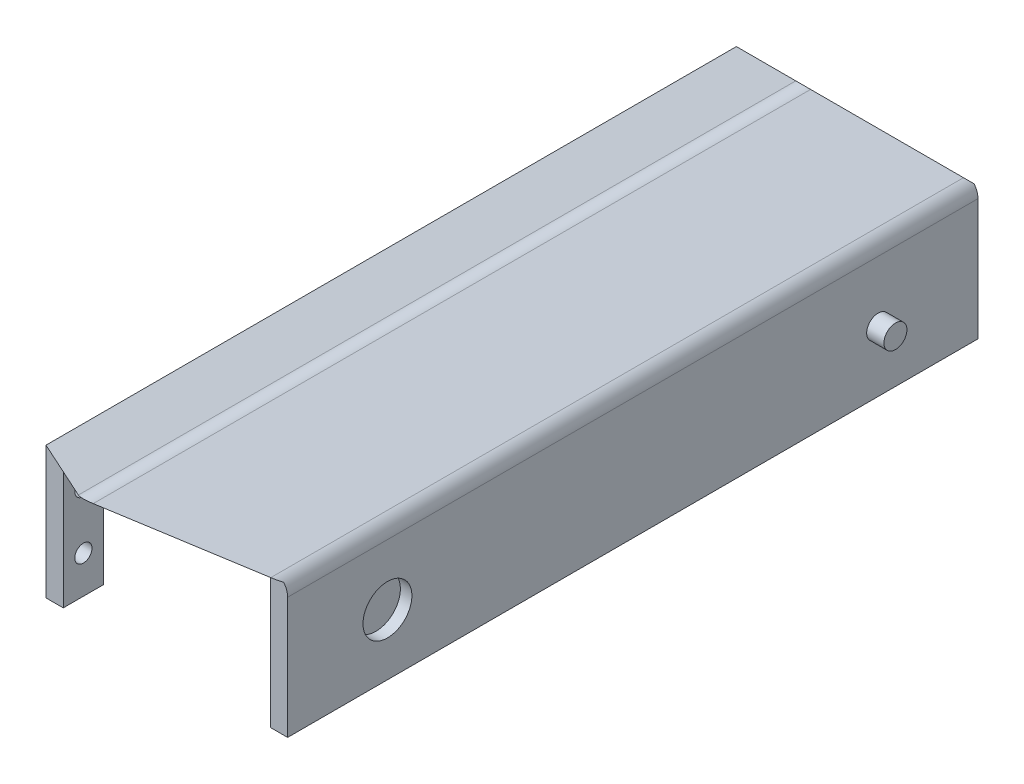
ISO-10303-21;
HEADER;
FILE_DESCRIPTION(('STEP AP214'),'2;1');
FILE_NAME('part.step','',(''),(''),'','','');
FILE_SCHEMA(('AUTOMOTIVE_DESIGN { 1 0 10303 214 1 1 1 1 }'));
ENDSEC;
DATA;
#1=APPLICATION_CONTEXT('core data for automotive mechanical design processes');
#2=APPLICATION_PROTOCOL_DEFINITION('international standard','automotive_design',2000,#1);
#3=PRODUCT_CONTEXT('',#1,'mechanical');
#4=PRODUCT('Part','Part','',(#3));
#5=PRODUCT_RELATED_PRODUCT_CATEGORY('part','',(#4));
#6=PRODUCT_DEFINITION_FORMATION('','',#4);
#7=PRODUCT_DEFINITION_CONTEXT('part definition',#1,'design');
#8=PRODUCT_DEFINITION('design','',#6,#7);
#9=PRODUCT_DEFINITION_SHAPE('','',#8);
#10=(LENGTH_UNIT() NAMED_UNIT(*) SI_UNIT(.MILLI.,.METRE.));
#11=(NAMED_UNIT(*) PLANE_ANGLE_UNIT() SI_UNIT($,.RADIAN.));
#12=(NAMED_UNIT(*) SI_UNIT($,.STERADIAN.) SOLID_ANGLE_UNIT());
#13=UNCERTAINTY_MEASURE_WITH_UNIT(LENGTH_MEASURE(1.E-05),#10,'distance_accuracy_value','');
#14=(GEOMETRIC_REPRESENTATION_CONTEXT(3) GLOBAL_UNCERTAINTY_ASSIGNED_CONTEXT((#13)) GLOBAL_UNIT_ASSIGNED_CONTEXT((#10,
#11,#12)) REPRESENTATION_CONTEXT('',''));
#15=CARTESIAN_POINT('',(0.,0.,0.));
#16=DIRECTION('',(0.,0.,1.));
#17=DIRECTION('',(1.,0.,0.));
#18=AXIS2_PLACEMENT_3D('',#15,#16,#17);
#19=CARTESIAN_POINT('',(-21.,0.,120.));
#20=DIRECTION('',(-1.,0.,0.));
#21=DIRECTION('',(0.,0.,1.));
#22=AXIS2_PLACEMENT_3D('',#19,#20,#21);
#23=PLANE('',#22);
#24=CARTESIAN_POINT('',(-21.,6.5,116.5));
#25=DIRECTION('',(-1.,0.,0.));
#26=DIRECTION('',(0.,0.,1.));
#27=AXIS2_PLACEMENT_3D('',#24,#25,#26);
#28=CIRCLE('',#27,1.5);
#29=CARTESIAN_POINT('',(-21.,6.5,118.));
#30=VERTEX_POINT('',#29);
#31=EDGE_CURVE('E210',#30,#30,#28,.F.);
#32=ORIENTED_EDGE('',*,*,#31,.T.);
#33=EDGE_LOOP('',(#32));
#34=FACE_BOUND('',#33,.T.);
#35=DIRECTION('',(0.,0.,-1.));
#36=VECTOR('',#35,1.);
#37=CARTESIAN_POINT('',(-21.,23.,120.));
#38=LINE('',#37,#36);
#39=CARTESIAN_POINT('',(-21.,23.,120.));
#40=VERTEX_POINT('',#39);
#41=CARTESIAN_POINT('',(-21.,23.,113.));
#42=VERTEX_POINT('',#41);
#43=EDGE_CURVE('E219',#40,#42,#38,.T.);
#44=ORIENTED_EDGE('',*,*,#43,.T.);
#45=DIRECTION('',(0.,-1.,0.));
#46=VECTOR('',#45,1.);
#47=CARTESIAN_POINT('',(-21.,0.,113.));
#48=LINE('',#47,#46);
#49=CARTESIAN_POINT('',(-21.,0.,113.));
#50=VERTEX_POINT('',#49);
#51=EDGE_CURVE('E201',#42,#50,#48,.T.);
#52=ORIENTED_EDGE('',*,*,#51,.T.);
#53=DIRECTION('',(0.,0.,-1.));
#54=VECTOR('',#53,1.);
#55=CARTESIAN_POINT('',(-21.,0.,120.));
#56=LINE('',#55,#54);
#57=CARTESIAN_POINT('',(-21.,0.,120.));
#58=VERTEX_POINT('',#57);
#59=EDGE_CURVE('E216',#58,#50,#56,.T.);
#60=ORIENTED_EDGE('',*,*,#59,.F.);
#61=DIRECTION('',(0.,1.,0.));
#62=VECTOR('',#61,1.);
#63=CARTESIAN_POINT('',(-21.,0.,120.));
#64=LINE('',#63,#62);
#65=EDGE_CURVE('E283',#58,#40,#64,.T.);
#66=ORIENTED_EDGE('',*,*,#65,.T.);
#67=EDGE_LOOP('',(#44,#52,#60,#66));
#68=FACE_BOUND('',#67,.T.);
#69=CARTESIAN_POINT('',(-21.,16.5,116.5));
#70=DIRECTION('',(-1.,0.,0.));
#71=DIRECTION('',(0.,0.,1.));
#72=AXIS2_PLACEMENT_3D('',#69,#70,#71);
#73=CIRCLE('',#72,1.5);
#74=CARTESIAN_POINT('',(-21.,16.5,118.));
#75=VERTEX_POINT('',#74);
#76=EDGE_CURVE('E579',#75,#75,#73,.F.);
#77=ORIENTED_EDGE('',*,*,#76,.T.);
#78=EDGE_LOOP('',(#77));
#79=FACE_BOUND('',#78,.T.);
#80=ADVANCED_FACE('F55',(#34,#68,#79),#23,.T.);
#81=CARTESIAN_POINT('',(-21.,6.5,70.));
#82=DIRECTION('',(-1.,0.,0.));
#83=DIRECTION('',(0.,0.,1.));
#84=AXIS2_PLACEMENT_3D('',#81,#82,#83);
#85=CIRCLE('',#84,1.50000000000001);
#86=CARTESIAN_POINT('',(-21.,6.5,71.5));
#87=VERTEX_POINT('',#86);
#88=EDGE_CURVE('E605',#87,#87,#85,.T.);
#89=ORIENTED_EDGE('',*,*,#88,.F.);
#90=EDGE_LOOP('',(#89));
#91=FACE_BOUND('',#90,.T.);
#92=DIRECTION('',(0.,-1.,0.));
#93=VECTOR('',#92,1.);
#94=CARTESIAN_POINT('',(-21.,0.,73.5));
#95=LINE('',#94,#93);
#96=CARTESIAN_POINT('',(-21.,23.,73.5));
#97=VERTEX_POINT('',#96);
#98=CARTESIAN_POINT('',(-21.,0.,73.5));
#99=VERTEX_POINT('',#98);
#100=EDGE_CURVE('E584',#97,#99,#95,.T.);
#101=ORIENTED_EDGE('',*,*,#100,.F.);
#102=CARTESIAN_POINT('',(-21.,23.,46.5));
#103=VERTEX_POINT('',#102);
#104=EDGE_CURVE('E235',#97,#103,#38,.T.);
#105=ORIENTED_EDGE('',*,*,#104,.T.);
#106=DIRECTION('',(0.,-1.,0.));
#107=VECTOR('',#106,1.);
#108=CARTESIAN_POINT('',(-21.,0.,46.5));
#109=LINE('',#108,#107);
#110=CARTESIAN_POINT('',(-21.,0.,46.5));
#111=VERTEX_POINT('',#110);
#112=EDGE_CURVE('E221',#103,#111,#109,.T.);
#113=ORIENTED_EDGE('',*,*,#112,.T.);
#114=EDGE_CURVE('E230',#99,#111,#56,.T.);
#115=ORIENTED_EDGE('',*,*,#114,.F.);
#116=EDGE_LOOP('',(#101,#105,#113,#115));
#117=FACE_BOUND('',#116,.T.);
#118=CARTESIAN_POINT('',(-21.,6.5,50.));
#119=DIRECTION('',(1.,0.,0.));
#120=DIRECTION('',(0.,0.,-1.));
#121=AXIS2_PLACEMENT_3D('',#118,#119,#120);
#122=CIRCLE('',#121,1.5);
#123=CARTESIAN_POINT('',(-21.,6.5,48.5));
#124=VERTEX_POINT('',#123);
#125=EDGE_CURVE('E549',#124,#124,#122,.T.);
#126=ORIENTED_EDGE('',*,*,#125,.T.);
#127=EDGE_LOOP('',(#126));
#128=FACE_BOUND('',#127,.T.);
#129=CARTESIAN_POINT('',(-21.,16.5,70.));
#130=DIRECTION('',(-1.,0.,0.));
#131=DIRECTION('',(0.,0.,1.));
#132=AXIS2_PLACEMENT_3D('',#129,#130,#131);
#133=CIRCLE('',#132,1.50000000000001);
#134=CARTESIAN_POINT('',(-21.,16.5,71.5));
#135=VERTEX_POINT('',#134);
#136=EDGE_CURVE('E550',#135,#135,#133,.T.);
#137=ORIENTED_EDGE('',*,*,#136,.F.);
#138=EDGE_LOOP('',(#137));
#139=FACE_BOUND('',#138,.T.);
#140=CARTESIAN_POINT('',(-21.,16.5,50.));
#141=DIRECTION('',(-1.,0.,0.));
#142=DIRECTION('',(0.,0.,1.));
#143=AXIS2_PLACEMENT_3D('',#140,#141,#142);
#144=CIRCLE('',#143,1.5);
#145=CARTESIAN_POINT('',(-21.,16.5,51.5));
#146=VERTEX_POINT('',#145);
#147=EDGE_CURVE('E570',#146,#146,#144,.F.);
#148=ORIENTED_EDGE('',*,*,#147,.T.);
#149=EDGE_LOOP('',(#148));
#150=FACE_BOUND('',#149,.T.);
#151=ADVANCED_FACE('F466',(#91,#117,#128,#139,#150),#23,.T.);
#152=CARTESIAN_POINT('',(0.,0.,120.));
#153=DIRECTION('',(0.,-1.,0.));
#154=DIRECTION('',(1.,0.,0.));
#155=AXIS2_PLACEMENT_3D('',#152,#153,#154);
#156=PLANE('',#155);
#157=ORIENTED_EDGE('',*,*,#59,.T.);
#158=DIRECTION('',(-1.,0.,0.));
#159=VECTOR('',#158,1.);
#160=CARTESIAN_POINT('',(-18.,0.,113.));
#161=LINE('',#160,#159);
#162=CARTESIAN_POINT('',(-18.,0.,113.));
#163=VERTEX_POINT('',#162);
#164=EDGE_CURVE('E198',#163,#50,#161,.T.);
#165=ORIENTED_EDGE('',*,*,#164,.F.);
#166=DIRECTION('',(0.,0.,-1.));
#167=VECTOR('',#166,1.);
#168=CARTESIAN_POINT('',(-18.,0.,120.));
#169=LINE('',#168,#167);
#170=CARTESIAN_POINT('',(-18.,0.,120.));
#171=VERTEX_POINT('',#170);
#172=EDGE_CURVE('E240',#171,#163,#169,.T.);
#173=ORIENTED_EDGE('',*,*,#172,.F.);
#174=DIRECTION('',(-1.,0.,0.));
#175=VECTOR('',#174,1.);
#176=CARTESIAN_POINT('',(0.,0.,120.));
#177=LINE('',#176,#175);
#178=EDGE_CURVE('E227',#171,#58,#177,.T.);
#179=ORIENTED_EDGE('',*,*,#178,.T.);
#180=EDGE_LOOP('',(#157,#165,#173,#179));
#181=FACE_BOUND('',#180,.T.);
#182=ADVANCED_FACE('F225',(#181),#156,.T.);
#183=DIRECTION('',(-1.,0.,0.));
#184=VECTOR('',#183,1.);
#185=CARTESIAN_POINT('',(-18.,0.,73.5));
#186=LINE('',#185,#184);
#187=CARTESIAN_POINT('',(-18.,0.,73.5));
#188=VERTEX_POINT('',#187);
#189=EDGE_CURVE('E209',#188,#99,#186,.T.);
#190=ORIENTED_EDGE('',*,*,#189,.T.);
#191=ORIENTED_EDGE('',*,*,#114,.T.);
#192=DIRECTION('',(-1.,0.,0.));
#193=VECTOR('',#192,1.);
#194=CARTESIAN_POINT('',(-18.,0.,46.5));
#195=LINE('',#194,#193);
#196=CARTESIAN_POINT('',(-18.,0.,46.5));
#197=VERTEX_POINT('',#196);
#198=EDGE_CURVE('E425',#197,#111,#195,.T.);
#199=ORIENTED_EDGE('',*,*,#198,.F.);
#200=EDGE_CURVE('E247',#188,#197,#169,.T.);
#201=ORIENTED_EDGE('',*,*,#200,.F.);
#202=EDGE_LOOP('',(#190,#191,#199,#201));
#203=FACE_BOUND('',#202,.T.);
#204=ADVANCED_FACE('F485',(#203),#156,.T.);
#205=CARTESIAN_POINT('',(-18.,0.,120.));
#206=DIRECTION('',(-1.,0.,0.));
#207=DIRECTION('',(0.,0.,1.));
#208=AXIS2_PLACEMENT_3D('',#205,#206,#207);
#209=PLANE('',#208);
#210=DIRECTION('',(0.,-1.,0.));
#211=VECTOR('',#210,1.);
#212=CARTESIAN_POINT('',(-18.,0.,113.));
#213=LINE('',#212,#211);
#214=CARTESIAN_POINT('',(-18.,23.,113.));
#215=VERTEX_POINT('',#214);
#216=EDGE_CURVE('E204',#215,#163,#213,.T.);
#217=ORIENTED_EDGE('',*,*,#216,.F.);
#218=DIRECTION('',(0.,0.,-1.));
#219=VECTOR('',#218,1.);
#220=CARTESIAN_POINT('',(-18.,23.,120.));
#221=LINE('',#220,#219);
#222=CARTESIAN_POINT('',(-18.,23.,120.));
#223=VERTEX_POINT('',#222);
#224=EDGE_CURVE('E255',#223,#215,#221,.T.);
#225=ORIENTED_EDGE('',*,*,#224,.F.);
#226=DIRECTION('',(0.,1.,0.));
#227=VECTOR('',#226,1.);
#228=CARTESIAN_POINT('',(-18.,0.,120.));
#229=LINE('',#228,#227);
#230=EDGE_CURVE('E272',#171,#223,#229,.T.);
#231=ORIENTED_EDGE('',*,*,#230,.F.);
#232=ORIENTED_EDGE('',*,*,#172,.T.);
#233=EDGE_LOOP('',(#217,#225,#231,#232));
#234=FACE_BOUND('',#233,.T.);
#235=CARTESIAN_POINT('',(-18.,6.5,116.5));
#236=DIRECTION('',(-1.,0.,0.));
#237=DIRECTION('',(0.,0.,1.));
#238=AXIS2_PLACEMENT_3D('',#235,#236,#237);
#239=CIRCLE('',#238,1.5);
#240=CARTESIAN_POINT('',(-18.,6.5,118.));
#241=VERTEX_POINT('',#240);
#242=EDGE_CURVE('E575',#241,#241,#239,.F.);
#243=ORIENTED_EDGE('',*,*,#242,.F.);
#244=EDGE_LOOP('',(#243));
#245=FACE_BOUND('',#244,.T.);
#246=CARTESIAN_POINT('',(-18.,16.5,116.5));
#247=DIRECTION('',(-1.,0.,0.));
#248=DIRECTION('',(0.,0.,1.));
#249=AXIS2_PLACEMENT_3D('',#246,#247,#248);
#250=CIRCLE('',#249,1.5);
#251=CARTESIAN_POINT('',(-18.,16.5,118.));
#252=VERTEX_POINT('',#251);
#253=EDGE_CURVE('E609',#252,#252,#250,.F.);
#254=ORIENTED_EDGE('',*,*,#253,.F.);
#255=EDGE_LOOP('',(#254));
#256=FACE_BOUND('',#255,.T.);
#257=ADVANCED_FACE('F719',(#234,#245,#256),#209,.F.);
#258=CARTESIAN_POINT('',(-18.,6.5,70.));
#259=DIRECTION('',(-1.,0.,0.));
#260=DIRECTION('',(0.,0.,1.));
#261=AXIS2_PLACEMENT_3D('',#258,#259,#260);
#262=CIRCLE('',#261,1.50000000000001);
#263=CARTESIAN_POINT('',(-18.,6.5,71.5));
#264=VERTEX_POINT('',#263);
#265=EDGE_CURVE('E574',#264,#264,#262,.T.);
#266=ORIENTED_EDGE('',*,*,#265,.T.);
#267=EDGE_LOOP('',(#266));
#268=FACE_BOUND('',#267,.T.);
#269=CARTESIAN_POINT('',(-18.,16.5,70.));
#270=DIRECTION('',(-1.,0.,0.));
#271=DIRECTION('',(0.,0.,1.));
#272=AXIS2_PLACEMENT_3D('',#269,#270,#271);
#273=CIRCLE('',#272,1.50000000000001);
#274=CARTESIAN_POINT('',(-18.,16.5,71.5));
#275=VERTEX_POINT('',#274);
#276=EDGE_CURVE('E616',#275,#275,#273,.T.);
#277=ORIENTED_EDGE('',*,*,#276,.T.);
#278=EDGE_LOOP('',(#277));
#279=FACE_BOUND('',#278,.T.);
#280=CARTESIAN_POINT('',(-18.,23.,73.5));
#281=VERTEX_POINT('',#280);
#282=CARTESIAN_POINT('',(-18.,23.,46.5));
#283=VERTEX_POINT('',#282);
#284=EDGE_CURVE('E262',#281,#283,#221,.T.);
#285=ORIENTED_EDGE('',*,*,#284,.F.);
#286=DIRECTION('',(0.,-1.,0.));
#287=VECTOR('',#286,1.);
#288=CARTESIAN_POINT('',(-18.,0.,73.5));
#289=LINE('',#288,#287);
#290=EDGE_CURVE('E79',#281,#188,#289,.T.);
#291=ORIENTED_EDGE('',*,*,#290,.T.);
#292=ORIENTED_EDGE('',*,*,#200,.T.);
#293=DIRECTION('',(0.,-1.,0.));
#294=VECTOR('',#293,1.);
#295=CARTESIAN_POINT('',(-18.,0.,46.5));
#296=LINE('',#295,#294);
#297=EDGE_CURVE('E498',#283,#197,#296,.T.);
#298=ORIENTED_EDGE('',*,*,#297,.F.);
#299=EDGE_LOOP('',(#285,#291,#292,#298));
#300=FACE_BOUND('',#299,.T.);
#301=CARTESIAN_POINT('',(-18.,6.5,50.));
#302=DIRECTION('',(1.,0.,0.));
#303=DIRECTION('',(0.,0.,-1.));
#304=AXIS2_PLACEMENT_3D('',#301,#302,#303);
#305=CIRCLE('',#304,1.5);
#306=CARTESIAN_POINT('',(-18.,6.5,48.5));
#307=VERTEX_POINT('',#306);
#308=EDGE_CURVE('E545',#307,#307,#305,.T.);
#309=ORIENTED_EDGE('',*,*,#308,.F.);
#310=EDGE_LOOP('',(#309));
#311=FACE_BOUND('',#310,.T.);
#312=CARTESIAN_POINT('',(-18.,16.5,50.));
#313=DIRECTION('',(-1.,0.,0.));
#314=DIRECTION('',(0.,0.,1.));
#315=AXIS2_PLACEMENT_3D('',#312,#313,#314);
#316=CIRCLE('',#315,1.5);
#317=CARTESIAN_POINT('',(-18.,16.5,51.5));
#318=VERTEX_POINT('',#317);
#319=EDGE_CURVE('E566',#318,#318,#316,.F.);
#320=ORIENTED_EDGE('',*,*,#319,.F.);
#321=EDGE_LOOP('',(#320));
#322=FACE_BOUND('',#321,.T.);
#323=ADVANCED_FACE('F538',(#268,#279,#300,#311,#322),#209,.F.);
#324=CARTESIAN_POINT('',(0.,0.,0.));
#325=DIRECTION('',(0.,0.,1.));
#326=DIRECTION('',(1.,0.,0.));
#327=AXIS2_PLACEMENT_3D('',#324,#325,#326);
#328=PLANE('',#327);
#329=DIRECTION('',(0.,1.,0.));
#330=VECTOR('',#329,1.);
#331=CARTESIAN_POINT('',(-21.,0.,0.));
#332=LINE('',#331,#330);
#333=CARTESIAN_POINT('',(-21.,0.,0.));
#334=VERTEX_POINT('',#333);
#335=CARTESIAN_POINT('',(-21.,23.,0.));
#336=VERTEX_POINT('',#335);
#337=EDGE_CURVE('E299',#334,#336,#332,.T.);
#338=ORIENTED_EDGE('',*,*,#337,.T.);
#339=DIRECTION('',(1.,0.,0.));
#340=VECTOR('',#339,1.);
#341=CARTESIAN_POINT('',(0.,23.,0.));
#342=LINE('',#341,#340);
#343=CARTESIAN_POINT('',(-18.,23.,0.));
#344=VERTEX_POINT('',#343);
#345=EDGE_CURVE('E359',#336,#344,#342,.T.);
#346=ORIENTED_EDGE('',*,*,#345,.T.);
#347=DIRECTION('',(0.,1.,0.));
#348=VECTOR('',#347,1.);
#349=CARTESIAN_POINT('',(-18.,0.,0.));
#350=LINE('',#349,#348);
#351=CARTESIAN_POINT('',(-18.,0.,0.));
#352=VERTEX_POINT('',#351);
#353=EDGE_CURVE('E306',#352,#344,#350,.T.);
#354=ORIENTED_EDGE('',*,*,#353,.F.);
#355=DIRECTION('',(-1.,0.,0.));
#356=VECTOR('',#355,1.);
#357=CARTESIAN_POINT('',(0.,0.,0.));
#358=LINE('',#357,#356);
#359=EDGE_CURVE('E303',#352,#334,#358,.T.);
#360=ORIENTED_EDGE('',*,*,#359,.T.);
#361=EDGE_LOOP('',(#338,#346,#354,#360));
#362=FACE_BOUND('',#361,.T.);
#363=ADVANCED_FACE('F507',(#362),#328,.F.);
#364=CARTESIAN_POINT('',(0.,0.,120.));
#365=DIRECTION('',(0.,0.,1.));
#366=DIRECTION('',(1.,0.,0.));
#367=AXIS2_PLACEMENT_3D('',#364,#365,#366);
#368=PLANE('',#367);
#369=DIRECTION('',(1.,0.,0.));
#370=VECTOR('',#369,1.);
#371=CARTESIAN_POINT('',(-18.,23.,120.));
#372=LINE('',#371,#370);
#373=EDGE_CURVE('E292',#40,#223,#372,.T.);
#374=ORIENTED_EDGE('',*,*,#373,.F.);
#375=ORIENTED_EDGE('',*,*,#65,.F.);
#376=ORIENTED_EDGE('',*,*,#178,.F.);
#377=ORIENTED_EDGE('',*,*,#230,.T.);
#378=EDGE_LOOP('',(#374,#375,#376,#377));
#379=FACE_BOUND('',#378,.T.);
#380=ADVANCED_FACE('F325',(#379),#368,.T.);
#381=CARTESIAN_POINT('',(-12.2357763871538,25.7400755325362,120.));
#382=DIRECTION('',(-0.429321334878652,0.903151809729689,0.));
#383=DIRECTION('',(-0.903151809729689,-0.429321334878652,0.));
#384=AXIS2_PLACEMENT_3D('',#381,#382,#383);
#385=PLANE('',#384);
#386=ORIENTED_EDGE('',*,*,#224,.T.);
#387=DIRECTION('',(0.,0.,-1.));
#388=VECTOR('',#387,1.);
#389=CARTESIAN_POINT('',(-18.,23.,0.));
#390=LINE('',#389,#388);
#391=EDGE_CURVE('E536',#215,#281,#390,.T.);
#392=ORIENTED_EDGE('',*,*,#391,.T.);
#393=ORIENTED_EDGE('',*,*,#284,.T.);
#394=DIRECTION('',(0.,0.,-1.));
#395=VECTOR('',#394,1.);
#396=CARTESIAN_POINT('',(-18.,23.,0.));
#397=LINE('',#396,#395);
#398=CARTESIAN_POINT('',(-18.,23.,7.00000000000001));
#399=VERTEX_POINT('',#398);
#400=EDGE_CURVE('E522',#283,#399,#397,.T.);
#401=ORIENTED_EDGE('',*,*,#400,.T.);
#402=EDGE_CURVE('E263',#399,#344,#221,.T.);
#403=ORIENTED_EDGE('',*,*,#402,.T.);
#404=DIRECTION('',(0.829901997593836,0.394501377937873,0.394501377937873));
#405=VECTOR('',#404,1.);
#406=CARTESIAN_POINT('',(26.154827576588,43.9893943767783,20.9893943767783));
#407=LINE('',#406,#405);
#408=CARTESIAN_POINT('',(0.,31.5564618755829,8.55646187558284));
#409=VERTEX_POINT('',#408);
#410=EDGE_CURVE('E422',#344,#409,#407,.T.);
#411=ORIENTED_EDGE('',*,*,#410,.T.);
#412=DIRECTION('',(0.,0.,-1.));
#413=VECTOR('',#412,1.);
#414=CARTESIAN_POINT('',(0.,31.5564618755828,120.));
#415=LINE('',#414,#413);
#416=CARTESIAN_POINT('',(0.,31.5564618755828,132.834692813374));
#417=VERTEX_POINT('',#416);
#418=EDGE_CURVE('E351',#417,#409,#415,.T.);
#419=ORIENTED_EDGE('',*,*,#418,.F.);
#420=DIRECTION('',(-0.759323099914227,-0.360951064203637,-0.541426596305456));
#421=VECTOR('',#420,1.);
#422=CARTESIAN_POINT('',(-13.9255168015939,24.936842230548,122.905263345822));
#423=LINE('',#422,#421);
#424=EDGE_CURVE('E402',#417,#223,#423,.T.);
#425=ORIENTED_EDGE('',*,*,#424,.T.);
#426=EDGE_LOOP('',(#386,#392,#393,#401,#403,#411,#419,#425));
#427=FACE_BOUND('',#426,.T.);
#428=ADVANCED_FACE('F439',(#427),#385,.F.);
#429=CARTESIAN_POINT('',(12.2357763871539,25.7400755325362,120.));
#430=DIRECTION('',(0.429321334878652,0.903151809729689,0.));
#431=DIRECTION('',(-0.903151809729689,0.429321334878652,0.));
#432=AXIS2_PLACEMENT_3D('',#429,#430,#431);
#433=PLANE('',#432);
#434=ORIENTED_EDGE('',*,*,#418,.T.);
#435=DIRECTION('',(0.829901997593836,-0.394501377937873,-0.394501377937873));
#436=VECTOR('',#435,1.);
#437=CARTESIAN_POINT('',(-26.154827576588,43.9893943767783,20.9893943767783));
#438=LINE('',#437,#436);
#439=CARTESIAN_POINT('',(18.,23.,0.));
#440=VERTEX_POINT('',#439);
#441=EDGE_CURVE('E416',#409,#440,#438,.T.);
#442=ORIENTED_EDGE('',*,*,#441,.T.);
#443=DIRECTION('',(0.,0.,-1.));
#444=VECTOR('',#443,1.);
#445=CARTESIAN_POINT('',(18.,23.,120.));
#446=LINE('',#445,#444);
#447=CARTESIAN_POINT('',(18.,23.,120.));
#448=VERTEX_POINT('',#447);
#449=EDGE_CURVE('E348',#448,#440,#446,.T.);
#450=ORIENTED_EDGE('',*,*,#449,.F.);
#451=DIRECTION('',(-0.759323099914226,0.360951064203637,0.541426596305456));
#452=VECTOR('',#451,1.);
#453=CARTESIAN_POINT('',(13.9255168015939,24.936842230548,122.905263345822));
#454=LINE('',#453,#452);
#455=EDGE_CURVE('E400',#448,#417,#454,.T.);
#456=ORIENTED_EDGE('',*,*,#455,.T.);
#457=EDGE_LOOP('',(#434,#442,#450,#456));
#458=FACE_BOUND('',#457,.T.);
#459=ADVANCED_FACE('F441',(#458),#433,.F.);
#460=CARTESIAN_POINT('',(18.,0.,120.));
#461=DIRECTION('',(-1.,0.,0.));
#462=DIRECTION('',(0.,-1.,0.));
#463=AXIS2_PLACEMENT_3D('',#460,#461,#462);
#464=PLANE('',#463);
#465=DIRECTION('',(0.,1.,0.));
#466=VECTOR('',#465,1.);
#467=CARTESIAN_POINT('',(18.,0.,0.));
#468=LINE('',#467,#466);
#469=CARTESIAN_POINT('',(18.,0.,0.));
#470=VERTEX_POINT('',#469);
#471=EDGE_CURVE('E287',#470,#440,#468,.T.);
#472=ORIENTED_EDGE('',*,*,#471,.F.);
#473=DIRECTION('',(0.,0.,-1.));
#474=VECTOR('',#473,1.);
#475=CARTESIAN_POINT('',(18.,0.,120.));
#476=LINE('',#475,#474);
#477=CARTESIAN_POINT('',(18.,0.,120.));
#478=VERTEX_POINT('',#477);
#479=EDGE_CURVE('E342',#478,#470,#476,.T.);
#480=ORIENTED_EDGE('',*,*,#479,.F.);
#481=DIRECTION('',(0.,1.,0.));
#482=VECTOR('',#481,1.);
#483=CARTESIAN_POINT('',(18.,0.,120.));
#484=LINE('',#483,#482);
#485=EDGE_CURVE('E308',#478,#448,#484,.T.);
#486=ORIENTED_EDGE('',*,*,#485,.T.);
#487=ORIENTED_EDGE('',*,*,#449,.T.);
#488=EDGE_LOOP('',(#472,#480,#486,#487));
#489=FACE_BOUND('',#488,.T.);
#490=ADVANCED_FACE('F443',(#489),#464,.T.);
#491=CARTESIAN_POINT('',(0.,0.,120.));
#492=DIRECTION('',(0.,-1.,0.));
#493=DIRECTION('',(1.,0.,0.));
#494=AXIS2_PLACEMENT_3D('',#491,#492,#493);
#495=PLANE('',#494);
#496=DIRECTION('',(-1.,0.,0.));
#497=VECTOR('',#496,1.);
#498=CARTESIAN_POINT('',(0.,0.,0.));
#499=LINE('',#498,#497);
#500=CARTESIAN_POINT('',(21.,0.,0.));
#501=VERTEX_POINT('',#500);
#502=EDGE_CURVE('E291',#501,#470,#499,.T.);
#503=ORIENTED_EDGE('',*,*,#502,.F.);
#504=DIRECTION('',(0.,0.,-1.));
#505=VECTOR('',#504,1.);
#506=CARTESIAN_POINT('',(21.,0.,120.));
#507=LINE('',#506,#505);
#508=CARTESIAN_POINT('',(21.,0.,120.));
#509=VERTEX_POINT('',#508);
#510=EDGE_CURVE('E338',#509,#501,#507,.T.);
#511=ORIENTED_EDGE('',*,*,#510,.F.);
#512=DIRECTION('',(-1.,0.,0.));
#513=VECTOR('',#512,1.);
#514=CARTESIAN_POINT('',(0.,0.,120.));
#515=LINE('',#514,#513);
#516=EDGE_CURVE('E311',#509,#478,#515,.T.);
#517=ORIENTED_EDGE('',*,*,#516,.T.);
#518=ORIENTED_EDGE('',*,*,#479,.T.);
#519=EDGE_LOOP('',(#503,#511,#517,#518));
#520=FACE_BOUND('',#519,.T.);
#521=ADVANCED_FACE('F450',(#520),#495,.T.);
#522=CARTESIAN_POINT('',(21.,0.,120.));
#523=DIRECTION('',(1.,0.,0.));
#524=DIRECTION('',(0.,0.,-1.));
#525=AXIS2_PLACEMENT_3D('',#522,#523,#524);
#526=PLANE('',#525);
#527=CARTESIAN_POINT('',(21.,10.5528995214839,17.350838596));
#528=DIRECTION('',(1.,0.,0.));
#529=DIRECTION('',(0.,0.,-1.));
#530=AXIS2_PLACEMENT_3D('',#527,#528,#529);
#531=CIRCLE('',#530,2.);
#532=CARTESIAN_POINT('',(21.,10.5528995214839,15.350838596));
#533=VERTEX_POINT('',#532);
#534=EDGE_CURVE('E632',#533,#533,#531,.T.);
#535=ORIENTED_EDGE('',*,*,#534,.F.);
#536=EDGE_LOOP('',(#535));
#537=FACE_BOUND('',#536,.T.);
#538=CARTESIAN_POINT('',(21.,10.5528995214839,102.649161404));
#539=DIRECTION('',(1.,0.,0.));
#540=DIRECTION('',(0.,0.,-1.));
#541=AXIS2_PLACEMENT_3D('',#538,#539,#540);
#542=CIRCLE('',#541,4.25000000000001);
#543=CARTESIAN_POINT('',(21.,10.5528995214839,98.399161404));
#544=VERTEX_POINT('',#543);
#545=EDGE_CURVE('E624',#544,#544,#542,.T.);
#546=ORIENTED_EDGE('',*,*,#545,.F.);
#547=EDGE_LOOP('',(#546));
#548=FACE_BOUND('',#547,.T.);
#549=DIRECTION('',(0.,-1.,0.));
#550=VECTOR('',#549,1.);
#551=CARTESIAN_POINT('',(21.,0.,0.));
#552=LINE('',#551,#550);
#553=CARTESIAN_POINT('',(21.,21.1057990429677,0.));
#554=VERTEX_POINT('',#553);
#555=EDGE_CURVE('E296',#554,#501,#552,.T.);
#556=ORIENTED_EDGE('',*,*,#555,.F.);
#557=DIRECTION('',(0.,0.,-1.));
#558=VECTOR('',#557,1.);
#559=CARTESIAN_POINT('',(21.,21.1057990429677,120.));
#560=LINE('',#559,#558);
#561=CARTESIAN_POINT('',(21.,21.1057990429677,120.));
#562=VERTEX_POINT('',#561);
#563=EDGE_CURVE('E383',#554,#562,#560,.F.);
#564=ORIENTED_EDGE('',*,*,#563,.T.);
#565=DIRECTION('',(0.,-1.,0.));
#566=VECTOR('',#565,1.);
#567=CARTESIAN_POINT('',(21.,0.,120.));
#568=LINE('',#567,#566);
#569=EDGE_CURVE('E318',#562,#509,#568,.T.);
#570=ORIENTED_EDGE('',*,*,#569,.T.);
#571=ORIENTED_EDGE('',*,*,#510,.T.);
#572=EDGE_LOOP('',(#556,#564,#570,#571));
#573=FACE_BOUND('',#572,.T.);
#574=ADVANCED_FACE('F452',(#537,#548,#573),#526,.T.);
#575=CARTESIAN_POINT('',(12.8096118299445,26.9001848428835,120.));
#576=DIRECTION('',(0.429933580392348,0.90286051882393,0.));
#577=DIRECTION('',(-0.90286051882393,0.429933580392348,0.));
#578=AXIS2_PLACEMENT_3D('',#575,#576,#577);
#579=PLANE('',#578);
#580=DIRECTION('',(-0.75876084220642,0.361314686764962,0.541972030147443));
#581=VECTOR('',#580,1.);
#582=CARTESIAN_POINT('',(15.2154046997389,25.7545691906005,124.131853785901));
#583=LINE('',#582,#581);
#584=CARTESIAN_POINT('',(19.289800741177,23.8143805994395,121.221570899159));
#585=VERTEX_POINT('',#584);
#586=CARTESIAN_POINT('',(1.28980074117705,32.3858091708681,134.078713756302));
#587=VERTEX_POINT('',#586);
#588=EDGE_CURVE('E411',#585,#587,#583,.T.);
#589=ORIENTED_EDGE('',*,*,#588,.F.);
#590=DIRECTION('',(0.,0.,-1.));
#591=VECTOR('',#590,1.);
#592=CARTESIAN_POINT('',(19.289800741177,23.8143805994395,120.));
#593=LINE('',#592,#591);
#594=CARTESIAN_POINT('',(19.289800741177,23.8143805994395,0.814380599439501));
#595=VERTEX_POINT('',#594);
#596=EDGE_CURVE('E373',#585,#595,#593,.T.);
#597=ORIENTED_EDGE('',*,*,#596,.T.);
#598=DIRECTION('',(0.829450130810032,-0.394976252766682,-0.394976252766682));
#599=VECTOR('',#598,1.);
#600=CARTESIAN_POINT('',(-25.2262090483619,45.01248049922,22.01248049922));
#601=LINE('',#600,#599);
#602=CARTESIAN_POINT('',(1.28980074117704,32.3858091708681,9.38580917086807));
#603=VERTEX_POINT('',#602);
#604=EDGE_CURVE('E409',#603,#595,#601,.T.);
#605=ORIENTED_EDGE('',*,*,#604,.F.);
#606=DIRECTION('',(0.,0.,-1.));
#607=VECTOR('',#606,1.);
#608=CARTESIAN_POINT('',(1.28980074117704,32.3858091708681,135.));
#609=LINE('',#608,#607);
#610=EDGE_CURVE('E366',#603,#587,#609,.F.);
#611=ORIENTED_EDGE('',*,*,#610,.T.);
#612=EDGE_LOOP('',(#589,#597,#605,#611));
#613=FACE_BOUND('',#612,.T.);
#614=ADVANCED_FACE('F408',(#613),#579,.T.);
#615=CARTESIAN_POINT('',(-12.8096118299445,26.9001848428835,120.));
#616=DIRECTION('',(0.429933580392348,-0.90286051882393,0.));
#617=DIRECTION('',(0.90286051882393,0.429933580392348,0.));
#618=AXIS2_PLACEMENT_3D('',#615,#616,#617);
#619=PLANE('',#618);
#620=DIRECTION('',(0.75876084220642,0.361314686764962,0.541972030147443));
#621=VECTOR('',#620,1.);
#622=CARTESIAN_POINT('',(-15.2154046997389,25.7545691906005,124.131853785901));
#623=LINE('',#622,#621);
#624=CARTESIAN_POINT('',(-1.28980074117705,32.3858091708681,134.078713756302));
#625=VERTEX_POINT('',#624);
#626=EDGE_CURVE('E333',#40,#625,#623,.T.);
#627=ORIENTED_EDGE('',*,*,#626,.T.);
#628=DIRECTION('',(0.,0.,-1.));
#629=VECTOR('',#628,1.);
#630=CARTESIAN_POINT('',(-1.28980074117704,32.3858091708681,9.99999999999999));
#631=LINE('',#630,#629);
#632=CARTESIAN_POINT('',(-1.28980074117704,32.3858091708681,9.38580917086807));
#633=VERTEX_POINT('',#632);
#634=EDGE_CURVE('E360',#625,#633,#631,.T.);
#635=ORIENTED_EDGE('',*,*,#634,.T.);
#636=DIRECTION('',(-0.829450130810032,-0.394976252766682,-0.394976252766682));
#637=VECTOR('',#636,1.);
#638=CARTESIAN_POINT('',(25.2262090483619,45.01248049922,22.01248049922));
#639=LINE('',#638,#637);
#640=EDGE_CURVE('E417',#633,#336,#639,.T.);
#641=ORIENTED_EDGE('',*,*,#640,.T.);
#642=CARTESIAN_POINT('',(-21.,23.,7.));
#643=VERTEX_POINT('',#642);
#644=EDGE_CURVE('E229',#643,#336,#38,.T.);
#645=ORIENTED_EDGE('',*,*,#644,.F.);
#646=DIRECTION('',(0.,0.,-1.));
#647=VECTOR('',#646,1.);
#648=CARTESIAN_POINT('',(-21.,23.,0.));
#649=LINE('',#648,#647);
#650=EDGE_CURVE('E499',#103,#643,#649,.T.);
#651=ORIENTED_EDGE('',*,*,#650,.F.);
#652=ORIENTED_EDGE('',*,*,#104,.F.);
#653=DIRECTION('',(0.,0.,-1.));
#654=VECTOR('',#653,1.);
#655=CARTESIAN_POINT('',(-21.,23.,0.));
#656=LINE('',#655,#654);
#657=EDGE_CURVE('E222',#42,#97,#656,.T.);
#658=ORIENTED_EDGE('',*,*,#657,.F.);
#659=ORIENTED_EDGE('',*,*,#43,.F.);
#660=EDGE_LOOP('',(#627,#635,#641,#645,#651,#652,#658,#659));
#661=FACE_BOUND('',#660,.T.);
#662=ADVANCED_FACE('F331',(#661),#619,.F.);
#663=CARTESIAN_POINT('',(-21.,16.5,3.5));
#664=DIRECTION('',(-1.,0.,0.));
#665=DIRECTION('',(0.,0.,1.));
#666=AXIS2_PLACEMENT_3D('',#663,#664,#665);
#667=CIRCLE('',#666,1.5);
#668=CARTESIAN_POINT('',(-21.,16.5,5.));
#669=VERTEX_POINT('',#668);
#670=EDGE_CURVE('E489',#669,#669,#667,.T.);
#671=ORIENTED_EDGE('',*,*,#670,.F.);
#672=EDGE_LOOP('',(#671));
#673=FACE_BOUND('',#672,.T.);
#674=CARTESIAN_POINT('',(-21.,6.5,3.5));
#675=DIRECTION('',(-1.,0.,0.));
#676=DIRECTION('',(0.,0.,1.));
#677=AXIS2_PLACEMENT_3D('',#674,#675,#676);
#678=CIRCLE('',#677,1.5);
#679=CARTESIAN_POINT('',(-21.,6.5,5.));
#680=VERTEX_POINT('',#679);
#681=EDGE_CURVE('E493',#680,#680,#678,.T.);
#682=ORIENTED_EDGE('',*,*,#681,.F.);
#683=EDGE_LOOP('',(#682));
#684=FACE_BOUND('',#683,.T.);
#685=DIRECTION('',(0.,-1.,0.));
#686=VECTOR('',#685,1.);
#687=CARTESIAN_POINT('',(-21.,0.,7.));
#688=LINE('',#687,#686);
#689=CARTESIAN_POINT('',(-21.,0.,7.));
#690=VERTEX_POINT('',#689);
#691=EDGE_CURVE('E495',#643,#690,#688,.T.);
#692=ORIENTED_EDGE('',*,*,#691,.F.);
#693=ORIENTED_EDGE('',*,*,#644,.T.);
#694=ORIENTED_EDGE('',*,*,#337,.F.);
#695=EDGE_CURVE('E232',#690,#334,#56,.T.);
#696=ORIENTED_EDGE('',*,*,#695,.F.);
#697=EDGE_LOOP('',(#692,#693,#694,#696));
#698=FACE_BOUND('',#697,.T.);
#699=ADVANCED_FACE('F469',(#673,#684,#698),#23,.T.);
#700=DIRECTION('',(-1.,0.,0.));
#701=VECTOR('',#700,1.);
#702=CARTESIAN_POINT('',(-18.,0.,7.));
#703=LINE('',#702,#701);
#704=CARTESIAN_POINT('',(-18.,0.,7.));
#705=VERTEX_POINT('',#704);
#706=EDGE_CURVE('E508',#705,#690,#703,.T.);
#707=ORIENTED_EDGE('',*,*,#706,.T.);
#708=ORIENTED_EDGE('',*,*,#695,.T.);
#709=ORIENTED_EDGE('',*,*,#359,.F.);
#710=EDGE_CURVE('E248',#705,#352,#169,.T.);
#711=ORIENTED_EDGE('',*,*,#710,.F.);
#712=EDGE_LOOP('',(#707,#708,#709,#711));
#713=FACE_BOUND('',#712,.T.);
#714=ADVANCED_FACE('F478',(#713),#156,.T.);
#715=CARTESIAN_POINT('',(-18.,16.5,3.5));
#716=DIRECTION('',(-1.,0.,0.));
#717=DIRECTION('',(0.,0.,1.));
#718=AXIS2_PLACEMENT_3D('',#715,#716,#717);
#719=CIRCLE('',#718,1.5);
#720=CARTESIAN_POINT('',(-18.,16.5,5.));
#721=VERTEX_POINT('',#720);
#722=EDGE_CURVE('E560',#721,#721,#719,.T.);
#723=ORIENTED_EDGE('',*,*,#722,.T.);
#724=EDGE_LOOP('',(#723));
#725=FACE_BOUND('',#724,.T.);
#726=CARTESIAN_POINT('',(-18.,6.5,3.5));
#727=DIRECTION('',(-1.,0.,0.));
#728=DIRECTION('',(0.,0.,1.));
#729=AXIS2_PLACEMENT_3D('',#726,#727,#728);
#730=CIRCLE('',#729,1.5);
#731=CARTESIAN_POINT('',(-18.,6.5,5.));
#732=VERTEX_POINT('',#731);
#733=EDGE_CURVE('E554',#732,#732,#730,.T.);
#734=ORIENTED_EDGE('',*,*,#733,.T.);
#735=EDGE_LOOP('',(#734));
#736=FACE_BOUND('',#735,.T.);
#737=ORIENTED_EDGE('',*,*,#402,.F.);
#738=DIRECTION('',(0.,-1.,0.));
#739=VECTOR('',#738,1.);
#740=CARTESIAN_POINT('',(-18.,0.,7.));
#741=LINE('',#740,#739);
#742=EDGE_CURVE('E71',#399,#705,#741,.T.);
#743=ORIENTED_EDGE('',*,*,#742,.T.);
#744=ORIENTED_EDGE('',*,*,#710,.T.);
#745=ORIENTED_EDGE('',*,*,#353,.T.);
#746=EDGE_LOOP('',(#737,#743,#744,#745));
#747=FACE_BOUND('',#746,.T.);
#748=ADVANCED_FACE('F484',(#725,#736,#747),#209,.F.);
#749=ORIENTED_EDGE('',*,*,#569,.F.);
#750=CARTESIAN_POINT('',(18.,21.1057990429677,120.));
#751=DIRECTION('',(0.,0.,1.));
#752=DIRECTION('',(1.,0.,0.));
#753=AXIS2_PLACEMENT_3D('',#750,#751,#752);
#754=CIRCLE('',#753,3.);
#755=CARTESIAN_POINT('',(20.326371151467,23.,120.));
#756=VERTEX_POINT('',#755);
#757=EDGE_CURVE('E64',#562,#756,#754,.T.);
#758=ORIENTED_EDGE('',*,*,#757,.T.);
#759=DIRECTION('',(1.,0.,0.));
#760=VECTOR('',#759,1.);
#761=CARTESIAN_POINT('',(21.,23.,120.));
#762=LINE('',#761,#760);
#763=EDGE_CURVE('E328',#448,#756,#762,.T.);
#764=ORIENTED_EDGE('',*,*,#763,.F.);
#765=ORIENTED_EDGE('',*,*,#485,.F.);
#766=ORIENTED_EDGE('',*,*,#516,.F.);
#767=EDGE_LOOP('',(#749,#758,#764,#765,#766));
#768=FACE_BOUND('',#767,.T.);
#769=ADVANCED_FACE('F391',(#768),#368,.T.);
#770=CARTESIAN_POINT('',(20.326371151467,23.,0.));
#771=VERTEX_POINT('',#770);
#772=EDGE_CURVE('E355',#440,#771,#342,.T.);
#773=ORIENTED_EDGE('',*,*,#772,.T.);
#774=CARTESIAN_POINT('',(18.,21.1057990429677,0.));
#775=DIRECTION('',(0.,0.,1.));
#776=DIRECTION('',(1.,0.,0.));
#777=AXIS2_PLACEMENT_3D('',#774,#775,#776);
#778=CIRCLE('',#777,3.);
#779=EDGE_CURVE('E380',#771,#554,#778,.F.);
#780=ORIENTED_EDGE('',*,*,#779,.T.);
#781=ORIENTED_EDGE('',*,*,#555,.T.);
#782=ORIENTED_EDGE('',*,*,#502,.T.);
#783=ORIENTED_EDGE('',*,*,#471,.T.);
#784=EDGE_LOOP('',(#773,#780,#781,#782,#783));
#785=FACE_BOUND('',#784,.T.);
#786=ADVANCED_FACE('F445',(#785),#328,.F.);
#787=CARTESIAN_POINT('',(22.,23.,120.));
#788=DIRECTION('',(0.,0.832050294337844,-0.554700196225229));
#789=DIRECTION('',(0.,0.554700196225229,0.832050294337844));
#790=AXIS2_PLACEMENT_3D('',#787,#788,#789);
#791=PLANE('',#790);
#792=ORIENTED_EDGE('',*,*,#763,.T.);
#793=CARTESIAN_POINT('',(18.,21.1057990429677,117.158698564452));
#794=DIRECTION('',(0.,0.832050294337844,-0.554700196225229));
#795=DIRECTION('',(0.,-0.554700196225229,-0.832050294337844));
#796=AXIS2_PLACEMENT_3D('',#793,#794,#795);
#797=ELLIPSE('',#796,5.40832691319599,3.);
#798=EDGE_CURVE('E11',#756,#585,#797,.F.);
#799=ORIENTED_EDGE('',*,*,#798,.T.);
#800=ORIENTED_EDGE('',*,*,#588,.T.);
#801=CARTESIAN_POINT('',(0.,29.6772276143963,130.015841421594));
#802=DIRECTION('',(0.,0.832050294337844,-0.554700196225229));
#803=DIRECTION('',(0.,0.554700196225229,0.832050294337844));
#804=AXIS2_PLACEMENT_3D('',#801,#802,#803);
#805=ELLIPSE('',#804,5.40832691319599,3.);
#806=EDGE_CURVE('E370',#587,#625,#805,.F.);
#807=ORIENTED_EDGE('',*,*,#806,.T.);
#808=ORIENTED_EDGE('',*,*,#626,.F.);
#809=ORIENTED_EDGE('',*,*,#373,.T.);
#810=ORIENTED_EDGE('',*,*,#424,.F.);
#811=ORIENTED_EDGE('',*,*,#455,.F.);
#812=EDGE_LOOP('',(#792,#799,#800,#807,#808,#809,#810,#811));
#813=FACE_BOUND('',#812,.T.);
#814=ADVANCED_FACE('F397',(#813),#791,.F.);
#815=CARTESIAN_POINT('',(-22.,33.,10.));
#816=DIRECTION('',(0.,-0.707106781186548,0.707106781186547));
#817=DIRECTION('',(0.,-0.707106781186547,-0.707106781186548));
#818=AXIS2_PLACEMENT_3D('',#815,#816,#817);
#819=PLANE('',#818);
#820=ORIENTED_EDGE('',*,*,#604,.T.);
#821=CARTESIAN_POINT('',(18.,21.1057990429677,-1.89420095703229));
#822=DIRECTION('',(0.,-0.707106781186548,0.707106781186547));
#823=DIRECTION('',(0.,-0.707106781186547,-0.707106781186548));
#824=AXIS2_PLACEMENT_3D('',#821,#822,#823);
#825=ELLIPSE('',#824,4.24264068711929,3.);
#826=EDGE_CURVE('E377',#595,#771,#825,.F.);
#827=ORIENTED_EDGE('',*,*,#826,.T.);
#828=ORIENTED_EDGE('',*,*,#772,.F.);
#829=ORIENTED_EDGE('',*,*,#441,.F.);
#830=ORIENTED_EDGE('',*,*,#410,.F.);
#831=ORIENTED_EDGE('',*,*,#345,.F.);
#832=ORIENTED_EDGE('',*,*,#640,.F.);
#833=CARTESIAN_POINT('',(0.,29.6772276143963,6.67722761439629));
#834=DIRECTION('',(0.,-0.707106781186548,0.707106781186547));
#835=DIRECTION('',(0.,0.707106781186547,0.707106781186548));
#836=AXIS2_PLACEMENT_3D('',#833,#834,#835);
#837=ELLIPSE('',#836,4.24264068711929,3.);
#838=EDGE_CURVE('E363',#633,#603,#837,.F.);
#839=ORIENTED_EDGE('',*,*,#838,.T.);
#840=EDGE_LOOP('',(#820,#827,#828,#829,#830,#831,#832,#839));
#841=FACE_BOUND('',#840,.T.);
#842=ADVANCED_FACE('F413',(#841),#819,.F.);
#843=CARTESIAN_POINT('',(0.,29.6772276143963,120.));
#844=DIRECTION('',(0.,0.,1.));
#845=DIRECTION('',(1.,0.,0.));
#846=AXIS2_PLACEMENT_3D('',#843,#844,#845);
#847=CYLINDRICAL_SURFACE('',#846,3.);
#848=ORIENTED_EDGE('',*,*,#806,.F.);
#849=ORIENTED_EDGE('',*,*,#610,.F.);
#850=ORIENTED_EDGE('',*,*,#838,.F.);
#851=ORIENTED_EDGE('',*,*,#634,.F.);
#852=EDGE_LOOP('',(#848,#849,#850,#851));
#853=FACE_BOUND('',#852,.T.);
#854=ADVANCED_FACE('F711',(#853),#847,.T.);
#855=CARTESIAN_POINT('',(18.,21.1057990429677,120.));
#856=DIRECTION('',(0.,0.,-1.));
#857=DIRECTION('',(-1.,0.,0.));
#858=AXIS2_PLACEMENT_3D('',#855,#856,#857);
#859=CYLINDRICAL_SURFACE('',#858,3.);
#860=ORIENTED_EDGE('',*,*,#757,.F.);
#861=ORIENTED_EDGE('',*,*,#563,.F.);
#862=ORIENTED_EDGE('',*,*,#779,.F.);
#863=ORIENTED_EDGE('',*,*,#826,.F.);
#864=ORIENTED_EDGE('',*,*,#596,.F.);
#865=ORIENTED_EDGE('',*,*,#798,.F.);
#866=EDGE_LOOP('',(#860,#861,#862,#863,#864,#865));
#867=FACE_BOUND('',#866,.T.);
#868=ADVANCED_FACE('F57',(#867),#859,.T.);
#869=CARTESIAN_POINT('',(-18.,0.,46.5));
#870=DIRECTION('',(0.,0.,-1.));
#871=DIRECTION('',(-1.,0.,0.));
#872=AXIS2_PLACEMENT_3D('',#869,#870,#871);
#873=PLANE('',#872);
#874=ORIENTED_EDGE('',*,*,#112,.F.);
#875=DIRECTION('',(-1.,0.,0.));
#876=VECTOR('',#875,1.);
#877=CARTESIAN_POINT('',(-18.,23.,46.5));
#878=LINE('',#877,#876);
#879=EDGE_CURVE('E515',#283,#103,#878,.T.);
#880=ORIENTED_EDGE('',*,*,#879,.F.);
#881=ORIENTED_EDGE('',*,*,#297,.T.);
#882=ORIENTED_EDGE('',*,*,#198,.T.);
#883=EDGE_LOOP('',(#874,#880,#881,#882));
#884=FACE_BOUND('',#883,.T.);
#885=ADVANCED_FACE('F704',(#884),#873,.T.);
#886=CARTESIAN_POINT('',(-18.,0.,7.));
#887=DIRECTION('',(0.,0.,-1.));
#888=DIRECTION('',(0.,1.,0.));
#889=AXIS2_PLACEMENT_3D('',#886,#887,#888);
#890=PLANE('',#889);
#891=ORIENTED_EDGE('',*,*,#691,.T.);
#892=ORIENTED_EDGE('',*,*,#706,.F.);
#893=ORIENTED_EDGE('',*,*,#742,.F.);
#894=DIRECTION('',(-1.,0.,0.));
#895=VECTOR('',#894,1.);
#896=CARTESIAN_POINT('',(-18.,23.,7.));
#897=LINE('',#896,#895);
#898=EDGE_CURVE('E510',#399,#643,#897,.T.);
#899=ORIENTED_EDGE('',*,*,#898,.T.);
#900=EDGE_LOOP('',(#891,#892,#893,#899));
#901=FACE_BOUND('',#900,.T.);
#902=ADVANCED_FACE('F701',(#901),#890,.F.);
#903=CARTESIAN_POINT('',(-18.,23.,0.));
#904=DIRECTION('',(0.,1.,0.));
#905=DIRECTION('',(0.,0.,1.));
#906=AXIS2_PLACEMENT_3D('',#903,#904,#905);
#907=PLANE('',#906);
#908=ORIENTED_EDGE('',*,*,#650,.T.);
#909=ORIENTED_EDGE('',*,*,#898,.F.);
#910=ORIENTED_EDGE('',*,*,#400,.F.);
#911=ORIENTED_EDGE('',*,*,#879,.T.);
#912=EDGE_LOOP('',(#908,#909,#910,#911));
#913=FACE_BOUND('',#912,.T.);
#914=ADVANCED_FACE('F532',(#913),#907,.F.);
#915=CARTESIAN_POINT('',(-18.,16.5,70.));
#916=DIRECTION('',(-1.,0.,0.));
#917=DIRECTION('',(0.,0.,1.));
#918=AXIS2_PLACEMENT_3D('',#915,#916,#917);
#919=CYLINDRICAL_SURFACE('',#918,1.50000000000001);
#920=ORIENTED_EDGE('',*,*,#276,.F.);
#921=EDGE_LOOP('',(#920));
#922=FACE_BOUND('',#921,.T.);
#923=ORIENTED_EDGE('',*,*,#136,.T.);
#924=EDGE_LOOP('',(#923));
#925=FACE_BOUND('',#924,.T.);
#926=ADVANCED_FACE('F661',(#922,#925),#919,.F.);
#927=CARTESIAN_POINT('',(-18.,6.5,50.));
#928=DIRECTION('',(-1.,0.,0.));
#929=DIRECTION('',(0.,0.,1.));
#930=AXIS2_PLACEMENT_3D('',#927,#928,#929);
#931=CYLINDRICAL_SURFACE('',#930,1.5);
#932=ORIENTED_EDGE('',*,*,#308,.T.);
#933=EDGE_LOOP('',(#932));
#934=FACE_BOUND('',#933,.T.);
#935=ORIENTED_EDGE('',*,*,#125,.F.);
#936=EDGE_LOOP('',(#935));
#937=FACE_BOUND('',#936,.T.);
#938=ADVANCED_FACE('F664',(#934,#937),#931,.F.);
#939=CARTESIAN_POINT('',(-18.,6.5,3.5));
#940=DIRECTION('',(-1.,0.,0.));
#941=DIRECTION('',(0.,0.,1.));
#942=AXIS2_PLACEMENT_3D('',#939,#940,#941);
#943=CYLINDRICAL_SURFACE('',#942,1.5);
#944=ORIENTED_EDGE('',*,*,#733,.F.);
#945=EDGE_LOOP('',(#944));
#946=FACE_BOUND('',#945,.T.);
#947=ORIENTED_EDGE('',*,*,#681,.T.);
#948=EDGE_LOOP('',(#947));
#949=FACE_BOUND('',#948,.T.);
#950=ADVANCED_FACE('F693',(#946,#949),#943,.F.);
#951=CARTESIAN_POINT('',(-18.,16.5,3.5));
#952=DIRECTION('',(-1.,0.,0.));
#953=DIRECTION('',(0.,0.,1.));
#954=AXIS2_PLACEMENT_3D('',#951,#952,#953);
#955=CYLINDRICAL_SURFACE('',#954,1.5);
#956=ORIENTED_EDGE('',*,*,#722,.F.);
#957=EDGE_LOOP('',(#956));
#958=FACE_BOUND('',#957,.T.);
#959=ORIENTED_EDGE('',*,*,#670,.T.);
#960=EDGE_LOOP('',(#959));
#961=FACE_BOUND('',#960,.T.);
#962=ADVANCED_FACE('F689',(#958,#961),#955,.F.);
#963=CARTESIAN_POINT('',(-18.,16.5,50.));
#964=DIRECTION('',(-1.,0.,0.));
#965=DIRECTION('',(0.,0.,1.));
#966=AXIS2_PLACEMENT_3D('',#963,#964,#965);
#967=CYLINDRICAL_SURFACE('',#966,1.5);
#968=ORIENTED_EDGE('',*,*,#319,.T.);
#969=EDGE_LOOP('',(#968));
#970=FACE_BOUND('',#969,.T.);
#971=ORIENTED_EDGE('',*,*,#147,.F.);
#972=EDGE_LOOP('',(#971));
#973=FACE_BOUND('',#972,.T.);
#974=ADVANCED_FACE('F677',(#970,#973),#967,.F.);
#975=CARTESIAN_POINT('',(-18.,0.,113.));
#976=DIRECTION('',(0.,0.,-1.));
#977=DIRECTION('',(0.,1.,0.));
#978=AXIS2_PLACEMENT_3D('',#975,#976,#977);
#979=PLANE('',#978);
#980=ORIENTED_EDGE('',*,*,#51,.F.);
#981=DIRECTION('',(-1.,0.,0.));
#982=VECTOR('',#981,1.);
#983=CARTESIAN_POINT('',(-18.,23.,113.));
#984=LINE('',#983,#982);
#985=EDGE_CURVE('E588',#215,#42,#984,.T.);
#986=ORIENTED_EDGE('',*,*,#985,.F.);
#987=ORIENTED_EDGE('',*,*,#216,.T.);
#988=ORIENTED_EDGE('',*,*,#164,.T.);
#989=EDGE_LOOP('',(#980,#986,#987,#988));
#990=FACE_BOUND('',#989,.T.);
#991=ADVANCED_FACE('F200',(#990),#979,.T.);
#992=CARTESIAN_POINT('',(-18.,0.,73.5));
#993=DIRECTION('',(0.,0.,-1.));
#994=DIRECTION('',(-1.,0.,0.));
#995=AXIS2_PLACEMENT_3D('',#992,#993,#994);
#996=PLANE('',#995);
#997=ORIENTED_EDGE('',*,*,#100,.T.);
#998=ORIENTED_EDGE('',*,*,#189,.F.);
#999=ORIENTED_EDGE('',*,*,#290,.F.);
#1000=DIRECTION('',(-1.,0.,0.));
#1001=VECTOR('',#1000,1.);
#1002=CARTESIAN_POINT('',(-18.,23.,73.5));
#1003=LINE('',#1002,#1001);
#1004=EDGE_CURVE('E597',#281,#97,#1003,.T.);
#1005=ORIENTED_EDGE('',*,*,#1004,.T.);
#1006=EDGE_LOOP('',(#997,#998,#999,#1005));
#1007=FACE_BOUND('',#1006,.T.);
#1008=ADVANCED_FACE('F676',(#1007),#996,.F.);
#1009=CARTESIAN_POINT('',(-18.,23.,0.));
#1010=DIRECTION('',(0.,1.,0.));
#1011=DIRECTION('',(0.,0.,1.));
#1012=AXIS2_PLACEMENT_3D('',#1009,#1010,#1011);
#1013=PLANE('',#1012);
#1014=ORIENTED_EDGE('',*,*,#657,.T.);
#1015=ORIENTED_EDGE('',*,*,#1004,.F.);
#1016=ORIENTED_EDGE('',*,*,#391,.F.);
#1017=ORIENTED_EDGE('',*,*,#985,.T.);
#1018=EDGE_LOOP('',(#1014,#1015,#1016,#1017));
#1019=FACE_BOUND('',#1018,.T.);
#1020=ADVANCED_FACE('F678',(#1019),#1013,.F.);
#1021=CARTESIAN_POINT('',(-18.,6.5,116.5));
#1022=DIRECTION('',(-1.,0.,0.));
#1023=DIRECTION('',(0.,0.,1.));
#1024=AXIS2_PLACEMENT_3D('',#1021,#1022,#1023);
#1025=CYLINDRICAL_SURFACE('',#1024,1.5);
#1026=ORIENTED_EDGE('',*,*,#242,.T.);
#1027=EDGE_LOOP('',(#1026));
#1028=FACE_BOUND('',#1027,.T.);
#1029=ORIENTED_EDGE('',*,*,#31,.F.);
#1030=EDGE_LOOP('',(#1029));
#1031=FACE_BOUND('',#1030,.T.);
#1032=ADVANCED_FACE('F669',(#1028,#1031),#1025,.F.);
#1033=CARTESIAN_POINT('',(-18.,16.5,116.5));
#1034=DIRECTION('',(-1.,0.,0.));
#1035=DIRECTION('',(0.,0.,1.));
#1036=AXIS2_PLACEMENT_3D('',#1033,#1034,#1035);
#1037=CYLINDRICAL_SURFACE('',#1036,1.5);
#1038=ORIENTED_EDGE('',*,*,#253,.T.);
#1039=EDGE_LOOP('',(#1038));
#1040=FACE_BOUND('',#1039,.T.);
#1041=ORIENTED_EDGE('',*,*,#76,.F.);
#1042=EDGE_LOOP('',(#1041));
#1043=FACE_BOUND('',#1042,.T.);
#1044=ADVANCED_FACE('F666',(#1040,#1043),#1037,.F.);
#1045=CARTESIAN_POINT('',(-18.,6.5,70.));
#1046=DIRECTION('',(-1.,0.,0.));
#1047=DIRECTION('',(0.,0.,1.));
#1048=AXIS2_PLACEMENT_3D('',#1045,#1046,#1047);
#1049=CYLINDRICAL_SURFACE('',#1048,1.50000000000001);
#1050=ORIENTED_EDGE('',*,*,#265,.F.);
#1051=EDGE_LOOP('',(#1050));
#1052=FACE_BOUND('',#1051,.T.);
#1053=ORIENTED_EDGE('',*,*,#88,.T.);
#1054=EDGE_LOOP('',(#1053));
#1055=FACE_BOUND('',#1054,.T.);
#1056=ADVANCED_FACE('F659',(#1052,#1055),#1049,.F.);
#1057=CARTESIAN_POINT('',(19.,10.5528995214839,102.649161404));
#1058=DIRECTION('',(1.,0.,0.));
#1059=DIRECTION('',(0.,0.,-1.));
#1060=AXIS2_PLACEMENT_3D('',#1057,#1058,#1059);
#1061=CYLINDRICAL_SURFACE('',#1060,4.25000000000001);
#1062=CARTESIAN_POINT('',(19.,10.5528995214839,102.649161404));
#1063=DIRECTION('',(1.,0.,0.));
#1064=DIRECTION('',(0.,0.,-1.));
#1065=AXIS2_PLACEMENT_3D('',#1062,#1063,#1064);
#1066=CIRCLE('',#1065,4.25000000000001);
#1067=CARTESIAN_POINT('',(19.,10.5528995214839,98.399161404));
#1068=VERTEX_POINT('',#1067);
#1069=EDGE_CURVE('E620',#1068,#1068,#1066,.T.);
#1070=ORIENTED_EDGE('',*,*,#1069,.F.);
#1071=EDGE_LOOP('',(#1070));
#1072=FACE_BOUND('',#1071,.T.);
#1073=ORIENTED_EDGE('',*,*,#545,.T.);
#1074=EDGE_LOOP('',(#1073));
#1075=FACE_BOUND('',#1074,.T.);
#1076=ADVANCED_FACE('F653',(#1072,#1075),#1061,.F.);
#1077=CARTESIAN_POINT('',(19.,10.5528995214839,102.649161404));
#1078=DIRECTION('',(1.,0.,0.));
#1079=DIRECTION('',(0.,0.,-1.));
#1080=AXIS2_PLACEMENT_3D('',#1077,#1078,#1079);
#1081=PLANE('',#1080);
#1082=ORIENTED_EDGE('',*,*,#1069,.T.);
#1083=EDGE_LOOP('',(#1082));
#1084=FACE_BOUND('',#1083,.T.);
#1085=ADVANCED_FACE('F645',(#1084),#1081,.T.);
#1086=CARTESIAN_POINT('',(24.,10.5528995214839,17.350838596));
#1087=DIRECTION('',(-1.,0.,0.));
#1088=DIRECTION('',(0.,0.,1.));
#1089=AXIS2_PLACEMENT_3D('',#1086,#1087,#1088);
#1090=CYLINDRICAL_SURFACE('',#1089,2.);
#1091=CARTESIAN_POINT('',(24.,10.5528995214839,17.350838596));
#1092=DIRECTION('',(1.,0.,0.));
#1093=DIRECTION('',(0.,0.,-1.));
#1094=AXIS2_PLACEMENT_3D('',#1091,#1092,#1093);
#1095=CIRCLE('',#1094,2.);
#1096=CARTESIAN_POINT('',(24.,10.5528995214839,15.350838596));
#1097=VERTEX_POINT('',#1096);
#1098=EDGE_CURVE('E628',#1097,#1097,#1095,.T.);
#1099=ORIENTED_EDGE('',*,*,#1098,.F.);
#1100=EDGE_LOOP('',(#1099));
#1101=FACE_BOUND('',#1100,.T.);
#1102=ORIENTED_EDGE('',*,*,#534,.T.);
#1103=EDGE_LOOP('',(#1102));
#1104=FACE_BOUND('',#1103,.T.);
#1105=ADVANCED_FACE('F642',(#1101,#1104),#1090,.T.);
#1106=CARTESIAN_POINT('',(24.,10.5528995214839,17.350838596));
#1107=DIRECTION('',(1.,0.,0.));
#1108=DIRECTION('',(0.,0.,-1.));
#1109=AXIS2_PLACEMENT_3D('',#1106,#1107,#1108);
#1110=PLANE('',#1109);
#1111=ORIENTED_EDGE('',*,*,#1098,.T.);
#1112=EDGE_LOOP('',(#1111));
#1113=FACE_BOUND('',#1112,.T.);
#1114=ADVANCED_FACE('F640',(#1113),#1110,.T.);
#1115=CLOSED_SHELL('',(#80,#151,#182,#204,#257,#323,#363,#380,#428,#459,#490,#521,#574,#614,
#662,#699,#714,#748,#769,#786,#814,#842,#854,#868,#885,#902,#914,#926,#938,#950,#962,#974,#991,
#1008,#1020,#1032,#1044,#1056,#1076,#1085,#1105,#1114));
#1116=MANIFOLD_SOLID_BREP('B2',#1115);
#1117=ADVANCED_BREP_SHAPE_REPRESENTATION('',(#18,#1116),#14);
#1118=SHAPE_DEFINITION_REPRESENTATION(#9,#1117);
ENDSEC;
END-ISO-10303-21;
